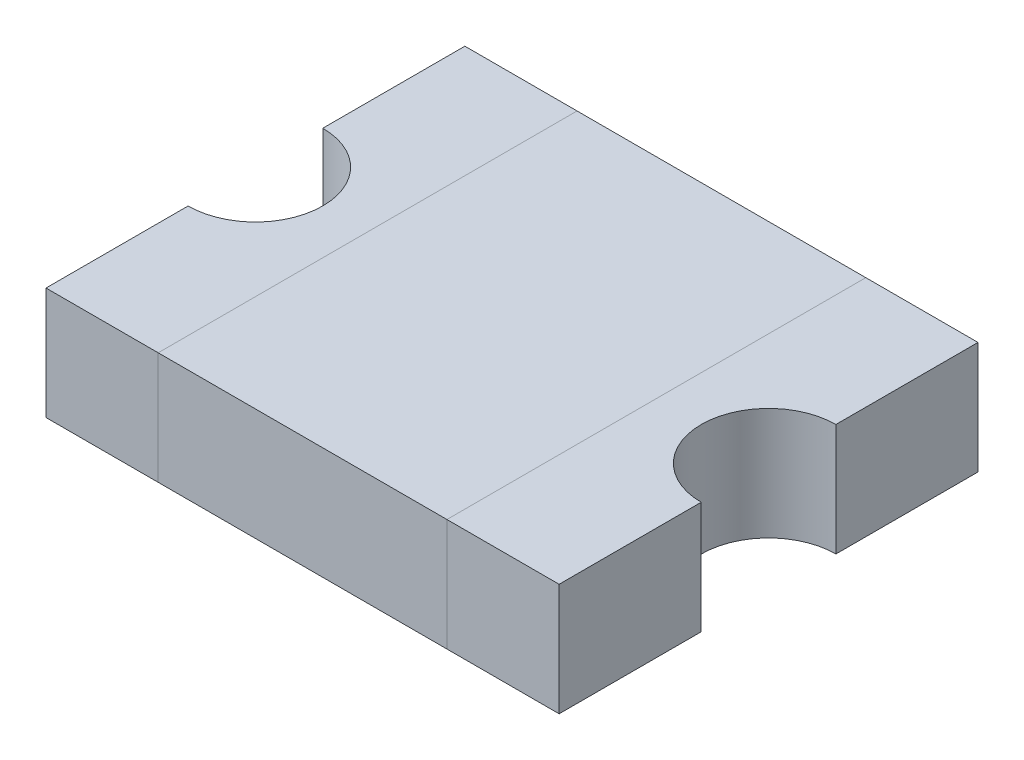
ISO-10303-21;
HEADER;
FILE_DESCRIPTION(('STEP AP214'),'2;1');
FILE_NAME('part.step','',(''),(''),'','','');
FILE_SCHEMA(('AUTOMOTIVE_DESIGN { 1 0 10303 214 1 1 1 1 }'));
ENDSEC;
DATA;
#1=APPLICATION_CONTEXT('core data for automotive mechanical design processes');
#2=APPLICATION_PROTOCOL_DEFINITION('international standard','automotive_design',2000,#1);
#3=PRODUCT_CONTEXT('',#1,'mechanical');
#4=PRODUCT('Part','Part','',(#3));
#5=PRODUCT_RELATED_PRODUCT_CATEGORY('part','',(#4));
#6=PRODUCT_DEFINITION_FORMATION('','',#4);
#7=PRODUCT_DEFINITION_CONTEXT('part definition',#1,'design');
#8=PRODUCT_DEFINITION('design','',#6,#7);
#9=PRODUCT_DEFINITION_SHAPE('','',#8);
#10=(LENGTH_UNIT() NAMED_UNIT(*) SI_UNIT(.MILLI.,.METRE.));
#11=(NAMED_UNIT(*) PLANE_ANGLE_UNIT() SI_UNIT($,.RADIAN.));
#12=(NAMED_UNIT(*) SI_UNIT($,.STERADIAN.) SOLID_ANGLE_UNIT());
#13=UNCERTAINTY_MEASURE_WITH_UNIT(LENGTH_MEASURE(1.E-05),#10,'distance_accuracy_value','');
#14=(GEOMETRIC_REPRESENTATION_CONTEXT(3) GLOBAL_UNCERTAINTY_ASSIGNED_CONTEXT((#13)) GLOBAL_UNIT_ASSIGNED_CONTEXT((#10,
#11,#12)) REPRESENTATION_CONTEXT('',''));
#15=CARTESIAN_POINT('',(0.,0.,0.));
#16=DIRECTION('',(0.,0.,1.));
#17=DIRECTION('',(1.,0.,0.));
#18=AXIS2_PLACEMENT_3D('',#15,#16,#17);
#19=CARTESIAN_POINT('',(-0.965,0.75,-1.4));
#20=DIRECTION('',(0.,0.,1.));
#21=DIRECTION('',(1.,0.,0.));
#22=AXIS2_PLACEMENT_3D('',#19,#20,#21);
#23=PLANE('',#22);
#24=DIRECTION('',(-1.,0.,0.));
#25=VECTOR('',#24,1.);
#26=CARTESIAN_POINT('',(-0.965,0.,-1.4));
#27=LINE('',#26,#25);
#28=CARTESIAN_POINT('',(-0.965,0.,-1.4));
#29=VERTEX_POINT('',#28);
#30=CARTESIAN_POINT('',(-1.715,0.,-1.4));
#31=VERTEX_POINT('',#30);
#32=EDGE_CURVE('E128',#29,#31,#27,.T.);
#33=ORIENTED_EDGE('',*,*,#32,.T.);
#34=DIRECTION('',(0.,-1.,0.));
#35=VECTOR('',#34,1.);
#36=CARTESIAN_POINT('',(-1.715,0.75,-1.4));
#37=LINE('',#36,#35);
#38=CARTESIAN_POINT('',(-1.715,0.75,-1.4));
#39=VERTEX_POINT('',#38);
#40=EDGE_CURVE('E12',#39,#31,#37,.T.);
#41=ORIENTED_EDGE('',*,*,#40,.F.);
#42=DIRECTION('',(-1.,0.,0.));
#43=VECTOR('',#42,1.);
#44=CARTESIAN_POINT('',(-0.965,0.75,-1.4));
#45=LINE('',#44,#43);
#46=CARTESIAN_POINT('',(-0.965,0.75,-1.4));
#47=VERTEX_POINT('',#46);
#48=EDGE_CURVE('E138',#47,#39,#45,.T.);
#49=ORIENTED_EDGE('',*,*,#48,.F.);
#50=DIRECTION('',(0.,-1.,0.));
#51=VECTOR('',#50,1.);
#52=CARTESIAN_POINT('',(-0.965,0.75,-1.4));
#53=LINE('',#52,#51);
#54=EDGE_CURVE('E124',#47,#29,#53,.T.);
#55=ORIENTED_EDGE('',*,*,#54,.T.);
#56=EDGE_LOOP('',(#33,#41,#49,#55));
#57=FACE_BOUND('',#56,.T.);
#58=ADVANCED_FACE('F44',(#57),#23,.F.);
#59=CARTESIAN_POINT('',(-1.715,0.75,-1.4));
#60=DIRECTION('',(1.,0.,0.));
#61=DIRECTION('',(0.,0.,-1.));
#62=AXIS2_PLACEMENT_3D('',#59,#60,#61);
#63=PLANE('',#62);
#64=DIRECTION('',(0.,0.,1.));
#65=VECTOR('',#64,1.);
#66=CARTESIAN_POINT('',(-1.715,0.,-1.4));
#67=LINE('',#66,#65);
#68=CARTESIAN_POINT('',(-1.715,0.,-0.45));
#69=VERTEX_POINT('',#68);
#70=EDGE_CURVE('E131',#31,#69,#67,.T.);
#71=ORIENTED_EDGE('',*,*,#70,.T.);
#72=DIRECTION('',(0.,-1.,0.));
#73=VECTOR('',#72,1.);
#74=CARTESIAN_POINT('',(-1.715,0.75,-0.45));
#75=LINE('',#74,#73);
#76=CARTESIAN_POINT('',(-1.715,0.75,-0.45));
#77=VERTEX_POINT('',#76);
#78=EDGE_CURVE('E52',#77,#69,#75,.T.);
#79=ORIENTED_EDGE('',*,*,#78,.F.);
#80=DIRECTION('',(0.,0.,1.));
#81=VECTOR('',#80,1.);
#82=CARTESIAN_POINT('',(-1.715,0.75,-1.4));
#83=LINE('',#82,#81);
#84=EDGE_CURVE('E97',#39,#77,#83,.T.);
#85=ORIENTED_EDGE('',*,*,#84,.F.);
#86=ORIENTED_EDGE('',*,*,#40,.T.);
#87=EDGE_LOOP('',(#71,#79,#85,#86));
#88=FACE_BOUND('',#87,.T.);
#89=ADVANCED_FACE('F162',(#88),#63,.F.);
#90=CARTESIAN_POINT('',(-1.715,0.75,0.));
#91=DIRECTION('',(0.,-1.,0.));
#92=DIRECTION('',(0.,0.,-1.));
#93=AXIS2_PLACEMENT_3D('',#90,#91,#92);
#94=CYLINDRICAL_SURFACE('',#93,0.45);
#95=CARTESIAN_POINT('',(-1.715,0.,0.));
#96=DIRECTION('',(0.,-1.,0.));
#97=DIRECTION('',(0.,0.,-1.));
#98=AXIS2_PLACEMENT_3D('',#95,#96,#97);
#99=CIRCLE('',#98,0.45);
#100=CARTESIAN_POINT('',(-1.715,0.,0.45));
#101=VERTEX_POINT('',#100);
#102=EDGE_CURVE('E133',#69,#101,#99,.T.);
#103=ORIENTED_EDGE('',*,*,#102,.T.);
#104=DIRECTION('',(0.,-1.,0.));
#105=VECTOR('',#104,1.);
#106=CARTESIAN_POINT('',(-1.715,0.75,0.45));
#107=LINE('',#106,#105);
#108=CARTESIAN_POINT('',(-1.715,0.75,0.45));
#109=VERTEX_POINT('',#108);
#110=EDGE_CURVE('E119',#109,#101,#107,.T.);
#111=ORIENTED_EDGE('',*,*,#110,.F.);
#112=CARTESIAN_POINT('',(-1.715,0.75,0.));
#113=DIRECTION('',(0.,-1.,0.));
#114=DIRECTION('',(0.,0.,-1.));
#115=AXIS2_PLACEMENT_3D('',#112,#113,#114);
#116=CIRCLE('',#115,0.45);
#117=EDGE_CURVE('E110',#77,#109,#116,.T.);
#118=ORIENTED_EDGE('',*,*,#117,.F.);
#119=ORIENTED_EDGE('',*,*,#78,.T.);
#120=EDGE_LOOP('',(#103,#111,#118,#119));
#121=FACE_BOUND('',#120,.T.);
#122=ADVANCED_FACE('F144',(#121),#94,.F.);
#123=CARTESIAN_POINT('',(-1.715,0.75,0.45));
#124=DIRECTION('',(1.,0.,0.));
#125=DIRECTION('',(0.,0.,-1.));
#126=AXIS2_PLACEMENT_3D('',#123,#124,#125);
#127=PLANE('',#126);
#128=DIRECTION('',(0.,0.,1.));
#129=VECTOR('',#128,1.);
#130=CARTESIAN_POINT('',(-1.715,0.,0.45));
#131=LINE('',#130,#129);
#132=CARTESIAN_POINT('',(-1.715,0.,1.4));
#133=VERTEX_POINT('',#132);
#134=EDGE_CURVE('E118',#101,#133,#131,.T.);
#135=ORIENTED_EDGE('',*,*,#134,.T.);
#136=DIRECTION('',(0.,-1.,0.));
#137=VECTOR('',#136,1.);
#138=CARTESIAN_POINT('',(-1.715,0.75,1.4));
#139=LINE('',#138,#137);
#140=CARTESIAN_POINT('',(-1.715,0.75,1.4));
#141=VERTEX_POINT('',#140);
#142=EDGE_CURVE('E115',#141,#133,#139,.T.);
#143=ORIENTED_EDGE('',*,*,#142,.F.);
#144=DIRECTION('',(0.,0.,1.));
#145=VECTOR('',#144,1.);
#146=CARTESIAN_POINT('',(-1.715,0.75,0.45));
#147=LINE('',#146,#145);
#148=EDGE_CURVE('E104',#109,#141,#147,.T.);
#149=ORIENTED_EDGE('',*,*,#148,.F.);
#150=ORIENTED_EDGE('',*,*,#110,.T.);
#151=EDGE_LOOP('',(#135,#143,#149,#150));
#152=FACE_BOUND('',#151,.T.);
#153=ADVANCED_FACE('F116',(#152),#127,.F.);
#154=CARTESIAN_POINT('',(-0.965,0.75,1.4));
#155=DIRECTION('',(0.,0.,-1.));
#156=DIRECTION('',(-1.,0.,0.));
#157=AXIS2_PLACEMENT_3D('',#154,#155,#156);
#158=PLANE('',#157);
#159=DIRECTION('',(1.,0.,0.));
#160=VECTOR('',#159,1.);
#161=CARTESIAN_POINT('',(-0.965,0.,1.4));
#162=LINE('',#161,#160);
#163=CARTESIAN_POINT('',(-0.965,0.,1.4));
#164=VERTEX_POINT('',#163);
#165=EDGE_CURVE('E83',#133,#164,#162,.T.);
#166=ORIENTED_EDGE('',*,*,#165,.T.);
#167=DIRECTION('',(0.,-1.,0.));
#168=VECTOR('',#167,1.);
#169=CARTESIAN_POINT('',(-0.965,0.75,1.4));
#170=LINE('',#169,#168);
#171=CARTESIAN_POINT('',(-0.965,0.75,1.4));
#172=VERTEX_POINT('',#171);
#173=EDGE_CURVE('E120',#172,#164,#170,.T.);
#174=ORIENTED_EDGE('',*,*,#173,.F.);
#175=DIRECTION('',(1.,0.,0.));
#176=VECTOR('',#175,1.);
#177=CARTESIAN_POINT('',(-0.965,0.75,1.4));
#178=LINE('',#177,#176);
#179=EDGE_CURVE('E108',#141,#172,#178,.T.);
#180=ORIENTED_EDGE('',*,*,#179,.F.);
#181=ORIENTED_EDGE('',*,*,#142,.T.);
#182=EDGE_LOOP('',(#166,#174,#180,#181));
#183=FACE_BOUND('',#182,.T.);
#184=ADVANCED_FACE('F122',(#183),#158,.F.);
#185=CARTESIAN_POINT('',(-0.965,0.75,-1.4));
#186=DIRECTION('',(-1.,0.,0.));
#187=DIRECTION('',(0.,0.,1.));
#188=AXIS2_PLACEMENT_3D('',#185,#186,#187);
#189=PLANE('',#188);
#190=DIRECTION('',(0.,0.,-1.));
#191=VECTOR('',#190,1.);
#192=CARTESIAN_POINT('',(-0.965,0.,-1.4));
#193=LINE('',#192,#191);
#194=EDGE_CURVE('E89',#164,#29,#193,.T.);
#195=ORIENTED_EDGE('',*,*,#194,.T.);
#196=ORIENTED_EDGE('',*,*,#54,.F.);
#197=DIRECTION('',(0.,0.,-1.));
#198=VECTOR('',#197,1.);
#199=CARTESIAN_POINT('',(-0.965,0.75,-1.4));
#200=LINE('',#199,#198);
#201=EDGE_CURVE('E60',#172,#47,#200,.T.);
#202=ORIENTED_EDGE('',*,*,#201,.F.);
#203=ORIENTED_EDGE('',*,*,#173,.T.);
#204=EDGE_LOOP('',(#195,#196,#202,#203));
#205=FACE_BOUND('',#204,.T.);
#206=ADVANCED_FACE('F151',(#205),#189,.F.);
#207=CARTESIAN_POINT('',(-1.715,0.75,0.));
#208=DIRECTION('',(0.,-1.,0.));
#209=DIRECTION('',(0.,0.,-1.));
#210=AXIS2_PLACEMENT_3D('',#207,#208,#209);
#211=PLANE('',#210);
#212=ORIENTED_EDGE('',*,*,#48,.T.);
#213=ORIENTED_EDGE('',*,*,#84,.T.);
#214=ORIENTED_EDGE('',*,*,#117,.T.);
#215=ORIENTED_EDGE('',*,*,#148,.T.);
#216=ORIENTED_EDGE('',*,*,#179,.T.);
#217=ORIENTED_EDGE('',*,*,#201,.T.);
#218=EDGE_LOOP('',(#212,#213,#214,#215,#216,#217));
#219=FACE_BOUND('',#218,.T.);
#220=ADVANCED_FACE('F106',(#219),#211,.F.);
#221=CARTESIAN_POINT('',(-1.715,0.,0.));
#222=DIRECTION('',(0.,-1.,0.));
#223=DIRECTION('',(0.,0.,-1.));
#224=AXIS2_PLACEMENT_3D('',#221,#222,#223);
#225=PLANE('',#224);
#226=ORIENTED_EDGE('',*,*,#32,.F.);
#227=ORIENTED_EDGE('',*,*,#194,.F.);
#228=ORIENTED_EDGE('',*,*,#165,.F.);
#229=ORIENTED_EDGE('',*,*,#134,.F.);
#230=ORIENTED_EDGE('',*,*,#102,.F.);
#231=ORIENTED_EDGE('',*,*,#70,.F.);
#232=EDGE_LOOP('',(#226,#227,#228,#229,#230,#231));
#233=FACE_BOUND('',#232,.T.);
#234=ADVANCED_FACE('F147',(#233),#225,.T.);
#235=CLOSED_SHELL('',(#58,#89,#122,#153,#184,#206,#220,#234));
#236=MANIFOLD_SOLID_BREP('B2',#235);
#237=CARTESIAN_POINT('',(1.715,0.75,0.));
#238=DIRECTION('',(0.,-1.,0.));
#239=DIRECTION('',(0.,0.,-1.));
#240=AXIS2_PLACEMENT_3D('',#237,#238,#239);
#241=CYLINDRICAL_SURFACE('',#240,0.45);
#242=CARTESIAN_POINT('',(1.715,0.,0.));
#243=DIRECTION('',(0.,-1.,0.));
#244=DIRECTION('',(0.,0.,1.));
#245=AXIS2_PLACEMENT_3D('',#242,#243,#244);
#246=CIRCLE('',#245,0.45);
#247=CARTESIAN_POINT('',(1.715,0.,0.45));
#248=VERTEX_POINT('',#247);
#249=CARTESIAN_POINT('',(1.715,0.,-0.45));
#250=VERTEX_POINT('',#249);
#251=EDGE_CURVE('E313',#248,#250,#246,.T.);
#252=ORIENTED_EDGE('',*,*,#251,.T.);
#253=DIRECTION('',(0.,-1.,0.));
#254=VECTOR('',#253,1.);
#255=CARTESIAN_POINT('',(1.715,0.75,-0.45));
#256=LINE('',#255,#254);
#257=CARTESIAN_POINT('',(1.715,0.75,-0.45));
#258=VERTEX_POINT('',#257);
#259=EDGE_CURVE('E42',#258,#250,#256,.T.);
#260=ORIENTED_EDGE('',*,*,#259,.F.);
#261=CARTESIAN_POINT('',(1.715,0.75,0.));
#262=DIRECTION('',(0.,-1.,0.));
#263=DIRECTION('',(0.,0.,1.));
#264=AXIS2_PLACEMENT_3D('',#261,#262,#263);
#265=CIRCLE('',#264,0.45);
#266=CARTESIAN_POINT('',(1.715,0.75,0.45));
#267=VERTEX_POINT('',#266);
#268=EDGE_CURVE('E323',#267,#258,#265,.T.);
#269=ORIENTED_EDGE('',*,*,#268,.F.);
#270=DIRECTION('',(0.,-1.,0.));
#271=VECTOR('',#270,1.);
#272=CARTESIAN_POINT('',(1.715,0.75,0.45));
#273=LINE('',#272,#271);
#274=EDGE_CURVE('E309',#267,#248,#273,.T.);
#275=ORIENTED_EDGE('',*,*,#274,.T.);
#276=EDGE_LOOP('',(#252,#260,#269,#275));
#277=FACE_BOUND('',#276,.T.);
#278=ADVANCED_FACE('F229',(#277),#241,.F.);
#279=CARTESIAN_POINT('',(1.715,0.75,-1.4));
#280=DIRECTION('',(-1.,0.,0.));
#281=DIRECTION('',(0.,0.,1.));
#282=AXIS2_PLACEMENT_3D('',#279,#280,#281);
#283=PLANE('',#282);
#284=DIRECTION('',(0.,0.,-1.));
#285=VECTOR('',#284,1.);
#286=CARTESIAN_POINT('',(1.715,0.,-1.4));
#287=LINE('',#286,#285);
#288=CARTESIAN_POINT('',(1.715,0.,-1.4));
#289=VERTEX_POINT('',#288);
#290=EDGE_CURVE('E316',#250,#289,#287,.T.);
#291=ORIENTED_EDGE('',*,*,#290,.T.);
#292=DIRECTION('',(0.,-1.,0.));
#293=VECTOR('',#292,1.);
#294=CARTESIAN_POINT('',(1.715,0.75,-1.4));
#295=LINE('',#294,#293);
#296=CARTESIAN_POINT('',(1.715,0.75,-1.4));
#297=VERTEX_POINT('',#296);
#298=EDGE_CURVE('E237',#297,#289,#295,.T.);
#299=ORIENTED_EDGE('',*,*,#298,.F.);
#300=DIRECTION('',(0.,0.,-1.));
#301=VECTOR('',#300,1.);
#302=CARTESIAN_POINT('',(1.715,0.75,-1.4));
#303=LINE('',#302,#301);
#304=EDGE_CURVE('E282',#258,#297,#303,.T.);
#305=ORIENTED_EDGE('',*,*,#304,.F.);
#306=ORIENTED_EDGE('',*,*,#259,.T.);
#307=EDGE_LOOP('',(#291,#299,#305,#306));
#308=FACE_BOUND('',#307,.T.);
#309=ADVANCED_FACE('F347',(#308),#283,.F.);
#310=CARTESIAN_POINT('',(0.965,0.75,-1.4));
#311=DIRECTION('',(0.,0.,1.));
#312=DIRECTION('',(1.,0.,0.));
#313=AXIS2_PLACEMENT_3D('',#310,#311,#312);
#314=PLANE('',#313);
#315=DIRECTION('',(-1.,0.,0.));
#316=VECTOR('',#315,1.);
#317=CARTESIAN_POINT('',(0.965,0.,-1.4));
#318=LINE('',#317,#316);
#319=CARTESIAN_POINT('',(0.965,0.,-1.4));
#320=VERTEX_POINT('',#319);
#321=EDGE_CURVE('E318',#289,#320,#318,.T.);
#322=ORIENTED_EDGE('',*,*,#321,.T.);
#323=DIRECTION('',(0.,-1.,0.));
#324=VECTOR('',#323,1.);
#325=CARTESIAN_POINT('',(0.965,0.75,-1.4));
#326=LINE('',#325,#324);
#327=CARTESIAN_POINT('',(0.965,0.75,-1.4));
#328=VERTEX_POINT('',#327);
#329=EDGE_CURVE('E304',#328,#320,#326,.T.);
#330=ORIENTED_EDGE('',*,*,#329,.F.);
#331=DIRECTION('',(-1.,0.,0.));
#332=VECTOR('',#331,1.);
#333=CARTESIAN_POINT('',(0.965,0.75,-1.4));
#334=LINE('',#333,#332);
#335=EDGE_CURVE('E295',#297,#328,#334,.T.);
#336=ORIENTED_EDGE('',*,*,#335,.F.);
#337=ORIENTED_EDGE('',*,*,#298,.T.);
#338=EDGE_LOOP('',(#322,#330,#336,#337));
#339=FACE_BOUND('',#338,.T.);
#340=ADVANCED_FACE('F329',(#339),#314,.F.);
#341=CARTESIAN_POINT('',(0.965,0.75,-1.4));
#342=DIRECTION('',(1.,0.,0.));
#343=DIRECTION('',(0.,0.,-1.));
#344=AXIS2_PLACEMENT_3D('',#341,#342,#343);
#345=PLANE('',#344);
#346=DIRECTION('',(0.,0.,1.));
#347=VECTOR('',#346,1.);
#348=CARTESIAN_POINT('',(0.965,0.,-1.4));
#349=LINE('',#348,#347);
#350=CARTESIAN_POINT('',(0.965,0.,1.4));
#351=VERTEX_POINT('',#350);
#352=EDGE_CURVE('E303',#320,#351,#349,.T.);
#353=ORIENTED_EDGE('',*,*,#352,.T.);
#354=DIRECTION('',(0.,-1.,0.));
#355=VECTOR('',#354,1.);
#356=CARTESIAN_POINT('',(0.965,0.75,1.4));
#357=LINE('',#356,#355);
#358=CARTESIAN_POINT('',(0.965,0.75,1.4));
#359=VERTEX_POINT('',#358);
#360=EDGE_CURVE('E300',#359,#351,#357,.T.);
#361=ORIENTED_EDGE('',*,*,#360,.F.);
#362=DIRECTION('',(0.,0.,1.));
#363=VECTOR('',#362,1.);
#364=CARTESIAN_POINT('',(0.965,0.75,-1.4));
#365=LINE('',#364,#363);
#366=EDGE_CURVE('E289',#328,#359,#365,.T.);
#367=ORIENTED_EDGE('',*,*,#366,.F.);
#368=ORIENTED_EDGE('',*,*,#329,.T.);
#369=EDGE_LOOP('',(#353,#361,#367,#368));
#370=FACE_BOUND('',#369,.T.);
#371=ADVANCED_FACE('F301',(#370),#345,.F.);
#372=CARTESIAN_POINT('',(0.965,0.75,1.4));
#373=DIRECTION('',(0.,0.,-1.));
#374=DIRECTION('',(-1.,0.,0.));
#375=AXIS2_PLACEMENT_3D('',#372,#373,#374);
#376=PLANE('',#375);
#377=DIRECTION('',(1.,0.,0.));
#378=VECTOR('',#377,1.);
#379=CARTESIAN_POINT('',(0.965,0.,1.4));
#380=LINE('',#379,#378);
#381=CARTESIAN_POINT('',(1.715,0.,1.4));
#382=VERTEX_POINT('',#381);
#383=EDGE_CURVE('E268',#351,#382,#380,.T.);
#384=ORIENTED_EDGE('',*,*,#383,.T.);
#385=DIRECTION('',(0.,-1.,0.));
#386=VECTOR('',#385,1.);
#387=CARTESIAN_POINT('',(1.715,0.75,1.4));
#388=LINE('',#387,#386);
#389=CARTESIAN_POINT('',(1.715,0.75,1.4));
#390=VERTEX_POINT('',#389);
#391=EDGE_CURVE('E305',#390,#382,#388,.T.);
#392=ORIENTED_EDGE('',*,*,#391,.F.);
#393=DIRECTION('',(1.,0.,0.));
#394=VECTOR('',#393,1.);
#395=CARTESIAN_POINT('',(0.965,0.75,1.4));
#396=LINE('',#395,#394);
#397=EDGE_CURVE('E293',#359,#390,#396,.T.);
#398=ORIENTED_EDGE('',*,*,#397,.F.);
#399=ORIENTED_EDGE('',*,*,#360,.T.);
#400=EDGE_LOOP('',(#384,#392,#398,#399));
#401=FACE_BOUND('',#400,.T.);
#402=ADVANCED_FACE('F307',(#401),#376,.F.);
#403=CARTESIAN_POINT('',(1.715,0.75,0.45));
#404=DIRECTION('',(-1.,0.,0.));
#405=DIRECTION('',(0.,0.,1.));
#406=AXIS2_PLACEMENT_3D('',#403,#404,#405);
#407=PLANE('',#406);
#408=DIRECTION('',(0.,0.,-1.));
#409=VECTOR('',#408,1.);
#410=CARTESIAN_POINT('',(1.715,0.,0.45));
#411=LINE('',#410,#409);
#412=EDGE_CURVE('E274',#382,#248,#411,.T.);
#413=ORIENTED_EDGE('',*,*,#412,.T.);
#414=ORIENTED_EDGE('',*,*,#274,.F.);
#415=DIRECTION('',(0.,0.,-1.));
#416=VECTOR('',#415,1.);
#417=CARTESIAN_POINT('',(1.715,0.75,0.45));
#418=LINE('',#417,#416);
#419=EDGE_CURVE('E245',#390,#267,#418,.T.);
#420=ORIENTED_EDGE('',*,*,#419,.F.);
#421=ORIENTED_EDGE('',*,*,#391,.T.);
#422=EDGE_LOOP('',(#413,#414,#420,#421));
#423=FACE_BOUND('',#422,.T.);
#424=ADVANCED_FACE('F336',(#423),#407,.F.);
#425=CARTESIAN_POINT('',(1.715,0.75,0.));
#426=DIRECTION('',(0.,1.,0.));
#427=DIRECTION('',(0.,0.,1.));
#428=AXIS2_PLACEMENT_3D('',#425,#426,#427);
#429=PLANE('',#428);
#430=ORIENTED_EDGE('',*,*,#268,.T.);
#431=ORIENTED_EDGE('',*,*,#304,.T.);
#432=ORIENTED_EDGE('',*,*,#335,.T.);
#433=ORIENTED_EDGE('',*,*,#366,.T.);
#434=ORIENTED_EDGE('',*,*,#397,.T.);
#435=ORIENTED_EDGE('',*,*,#419,.T.);
#436=EDGE_LOOP('',(#430,#431,#432,#433,#434,#435));
#437=FACE_BOUND('',#436,.T.);
#438=ADVANCED_FACE('F291',(#437),#429,.T.);
#439=CARTESIAN_POINT('',(1.715,0.,0.));
#440=DIRECTION('',(0.,1.,0.));
#441=DIRECTION('',(0.,0.,1.));
#442=AXIS2_PLACEMENT_3D('',#439,#440,#441);
#443=PLANE('',#442);
#444=ORIENTED_EDGE('',*,*,#251,.F.);
#445=ORIENTED_EDGE('',*,*,#412,.F.);
#446=ORIENTED_EDGE('',*,*,#383,.F.);
#447=ORIENTED_EDGE('',*,*,#352,.F.);
#448=ORIENTED_EDGE('',*,*,#321,.F.);
#449=ORIENTED_EDGE('',*,*,#290,.F.);
#450=EDGE_LOOP('',(#444,#445,#446,#447,#448,#449));
#451=FACE_BOUND('',#450,.T.);
#452=ADVANCED_FACE('F332',(#451),#443,.F.);
#453=CLOSED_SHELL('',(#278,#309,#340,#371,#402,#424,#438,#452));
#454=MANIFOLD_SOLID_BREP('B6',#453);
#455=CARTESIAN_POINT('',(0.965,0.75,1.4));
#456=DIRECTION('',(-1.,0.,0.));
#457=DIRECTION('',(0.,0.,1.));
#458=AXIS2_PLACEMENT_3D('',#455,#456,#457);
#459=PLANE('',#458);
#460=DIRECTION('',(0.,0.,-1.));
#461=VECTOR('',#460,1.);
#462=CARTESIAN_POINT('',(0.965,0.,1.4));
#463=LINE('',#462,#461);
#464=CARTESIAN_POINT('',(0.965,0.,1.4));
#465=VERTEX_POINT('',#464);
#466=CARTESIAN_POINT('',(0.965,0.,-1.4));
#467=VERTEX_POINT('',#466);
#468=EDGE_CURVE('E468',#465,#467,#463,.T.);
#469=ORIENTED_EDGE('',*,*,#468,.T.);
#470=DIRECTION('',(0.,-1.,0.));
#471=VECTOR('',#470,1.);
#472=CARTESIAN_POINT('',(0.965,0.75,-1.4));
#473=LINE('',#472,#471);
#474=CARTESIAN_POINT('',(0.965,0.75,-1.4));
#475=VERTEX_POINT('',#474);
#476=EDGE_CURVE('E227',#475,#467,#473,.T.);
#477=ORIENTED_EDGE('',*,*,#476,.F.);
#478=DIRECTION('',(0.,0.,-1.));
#479=VECTOR('',#478,1.);
#480=CARTESIAN_POINT('',(0.965,0.75,1.4));
#481=LINE('',#480,#479);
#482=CARTESIAN_POINT('',(0.965,0.75,1.4));
#483=VERTEX_POINT('',#482);
#484=EDGE_CURVE('E456',#483,#475,#481,.T.);
#485=ORIENTED_EDGE('',*,*,#484,.F.);
#486=DIRECTION('',(0.,-1.,0.));
#487=VECTOR('',#486,1.);
#488=CARTESIAN_POINT('',(0.965,0.75,1.4));
#489=LINE('',#488,#487);
#490=EDGE_CURVE('E464',#483,#465,#489,.T.);
#491=ORIENTED_EDGE('',*,*,#490,.T.);
#492=EDGE_LOOP('',(#469,#477,#485,#491));
#493=FACE_BOUND('',#492,.T.);
#494=ADVANCED_FACE('F405',(#493),#459,.F.);
#495=CARTESIAN_POINT('',(-0.965,0.75,-1.4));
#496=DIRECTION('',(0.,0.,1.));
#497=DIRECTION('',(1.,0.,0.));
#498=AXIS2_PLACEMENT_3D('',#495,#496,#497);
#499=PLANE('',#498);
#500=DIRECTION('',(-1.,0.,0.));
#501=VECTOR('',#500,1.);
#502=CARTESIAN_POINT('',(-0.965,0.,-1.4));
#503=LINE('',#502,#501);
#504=CARTESIAN_POINT('',(-0.965,0.,-1.4));
#505=VERTEX_POINT('',#504);
#506=EDGE_CURVE('E460',#467,#505,#503,.T.);
#507=ORIENTED_EDGE('',*,*,#506,.T.);
#508=DIRECTION('',(0.,-1.,0.));
#509=VECTOR('',#508,1.);
#510=CARTESIAN_POINT('',(-0.965,0.75,-1.4));
#511=LINE('',#510,#509);
#512=CARTESIAN_POINT('',(-0.965,0.75,-1.4));
#513=VERTEX_POINT('',#512);
#514=EDGE_CURVE('E413',#513,#505,#511,.T.);
#515=ORIENTED_EDGE('',*,*,#514,.F.);
#516=DIRECTION('',(-1.,0.,0.));
#517=VECTOR('',#516,1.);
#518=CARTESIAN_POINT('',(-0.965,0.75,-1.4));
#519=LINE('',#518,#517);
#520=EDGE_CURVE('E451',#475,#513,#519,.T.);
#521=ORIENTED_EDGE('',*,*,#520,.F.);
#522=ORIENTED_EDGE('',*,*,#476,.T.);
#523=EDGE_LOOP('',(#507,#515,#521,#522));
#524=FACE_BOUND('',#523,.T.);
#525=ADVANCED_FACE('F459',(#524),#499,.F.);
#526=CARTESIAN_POINT('',(-0.965,0.75,1.4));
#527=DIRECTION('',(1.,0.,0.));
#528=DIRECTION('',(0.,0.,-1.));
#529=AXIS2_PLACEMENT_3D('',#526,#527,#528);
#530=PLANE('',#529);
#531=DIRECTION('',(0.,0.,1.));
#532=VECTOR('',#531,1.);
#533=CARTESIAN_POINT('',(-0.965,0.,1.4));
#534=LINE('',#533,#532);
#535=CARTESIAN_POINT('',(-0.965,0.,1.4));
#536=VERTEX_POINT('',#535);
#537=EDGE_CURVE('E438',#505,#536,#534,.T.);
#538=ORIENTED_EDGE('',*,*,#537,.T.);
#539=DIRECTION('',(0.,-1.,0.));
#540=VECTOR('',#539,1.);
#541=CARTESIAN_POINT('',(-0.965,0.75,1.4));
#542=LINE('',#541,#540);
#543=CARTESIAN_POINT('',(-0.965,0.75,1.4));
#544=VERTEX_POINT('',#543);
#545=EDGE_CURVE('E461',#544,#536,#542,.T.);
#546=ORIENTED_EDGE('',*,*,#545,.F.);
#547=DIRECTION('',(0.,0.,1.));
#548=VECTOR('',#547,1.);
#549=CARTESIAN_POINT('',(-0.965,0.75,1.4));
#550=LINE('',#549,#548);
#551=EDGE_CURVE('E454',#513,#544,#550,.T.);
#552=ORIENTED_EDGE('',*,*,#551,.F.);
#553=ORIENTED_EDGE('',*,*,#514,.T.);
#554=EDGE_LOOP('',(#538,#546,#552,#553));
#555=FACE_BOUND('',#554,.T.);
#556=ADVANCED_FACE('F462',(#555),#530,.F.);
#557=CARTESIAN_POINT('',(-0.965,0.75,1.4));
#558=DIRECTION('',(0.,0.,-1.));
#559=DIRECTION('',(-1.,0.,0.));
#560=AXIS2_PLACEMENT_3D('',#557,#558,#559);
#561=PLANE('',#560);
#562=DIRECTION('',(1.,0.,0.));
#563=VECTOR('',#562,1.);
#564=CARTESIAN_POINT('',(-0.965,0.,1.4));
#565=LINE('',#564,#563);
#566=EDGE_CURVE('E444',#536,#465,#565,.T.);
#567=ORIENTED_EDGE('',*,*,#566,.T.);
#568=ORIENTED_EDGE('',*,*,#490,.F.);
#569=DIRECTION('',(1.,0.,0.));
#570=VECTOR('',#569,1.);
#571=CARTESIAN_POINT('',(-0.965,0.75,1.4));
#572=LINE('',#571,#570);
#573=EDGE_CURVE('E421',#544,#483,#572,.T.);
#574=ORIENTED_EDGE('',*,*,#573,.F.);
#575=ORIENTED_EDGE('',*,*,#545,.T.);
#576=EDGE_LOOP('',(#567,#568,#574,#575));
#577=FACE_BOUND('',#576,.T.);
#578=ADVANCED_FACE('F475',(#577),#561,.F.);
#579=CARTESIAN_POINT('',(0.,0.75,0.));
#580=DIRECTION('',(0.,-1.,0.));
#581=DIRECTION('',(0.,0.,-1.));
#582=AXIS2_PLACEMENT_3D('',#579,#580,#581);
#583=PLANE('',#582);
#584=ORIENTED_EDGE('',*,*,#484,.T.);
#585=ORIENTED_EDGE('',*,*,#520,.T.);
#586=ORIENTED_EDGE('',*,*,#551,.T.);
#587=ORIENTED_EDGE('',*,*,#573,.T.);
#588=EDGE_LOOP('',(#584,#585,#586,#587));
#589=FACE_BOUND('',#588,.T.);
#590=ADVANCED_FACE('F452',(#589),#583,.F.);
#591=CARTESIAN_POINT('',(0.,0.,0.));
#592=DIRECTION('',(0.,-1.,0.));
#593=DIRECTION('',(0.,0.,-1.));
#594=AXIS2_PLACEMENT_3D('',#591,#592,#593);
#595=PLANE('',#594);
#596=ORIENTED_EDGE('',*,*,#468,.F.);
#597=ORIENTED_EDGE('',*,*,#566,.F.);
#598=ORIENTED_EDGE('',*,*,#537,.F.);
#599=ORIENTED_EDGE('',*,*,#506,.F.);
#600=EDGE_LOOP('',(#596,#597,#598,#599));
#601=FACE_BOUND('',#600,.T.);
#602=ADVANCED_FACE('F478',(#601),#595,.T.);
#603=CLOSED_SHELL('',(#494,#525,#556,#578,#590,#602));
#604=MANIFOLD_SOLID_BREP('B36',#603);
#605=ADVANCED_BREP_SHAPE_REPRESENTATION('',(#18,#236,#454,#604),#14);
#606=SHAPE_DEFINITION_REPRESENTATION(#9,#605);
ENDSEC;
END-ISO-10303-21;
